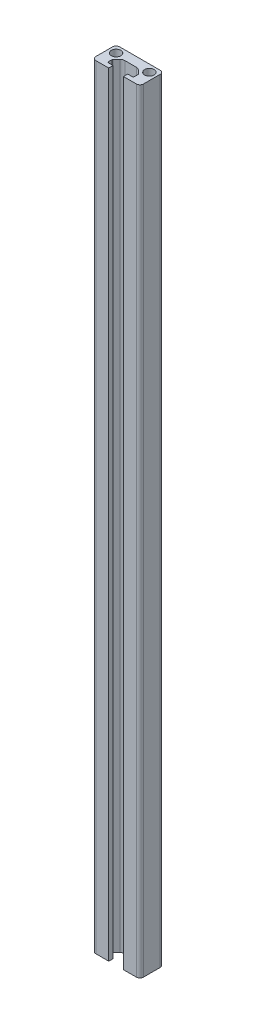
ISO-10303-21;
HEADER;
FILE_DESCRIPTION(('STEP AP214'),'2;1');
FILE_NAME('part.step','',(''),(''),'','','');
FILE_SCHEMA(('AUTOMOTIVE_DESIGN { 1 0 10303 214 1 1 1 1 }'));
ENDSEC;
DATA;
#1=APPLICATION_CONTEXT('core data for automotive mechanical design processes');
#2=APPLICATION_PROTOCOL_DEFINITION('international standard','automotive_design',2000,#1);
#3=PRODUCT_CONTEXT('',#1,'mechanical');
#4=PRODUCT('Part','Part','',(#3));
#5=PRODUCT_RELATED_PRODUCT_CATEGORY('part','',(#4));
#6=PRODUCT_DEFINITION_FORMATION('','',#4);
#7=PRODUCT_DEFINITION_CONTEXT('part definition',#1,'design');
#8=PRODUCT_DEFINITION('design','',#6,#7);
#9=PRODUCT_DEFINITION_SHAPE('','',#8);
#10=(LENGTH_UNIT() NAMED_UNIT(*) SI_UNIT(.MILLI.,.METRE.));
#11=(NAMED_UNIT(*) PLANE_ANGLE_UNIT() SI_UNIT($,.RADIAN.));
#12=(NAMED_UNIT(*) SI_UNIT($,.STERADIAN.) SOLID_ANGLE_UNIT());
#13=UNCERTAINTY_MEASURE_WITH_UNIT(LENGTH_MEASURE(1.E-05),#10,'distance_accuracy_value','');
#14=(GEOMETRIC_REPRESENTATION_CONTEXT(3) GLOBAL_UNCERTAINTY_ASSIGNED_CONTEXT((#13)) GLOBAL_UNIT_ASSIGNED_CONTEXT((#10,
#11,#12)) REPRESENTATION_CONTEXT('',''));
#15=CARTESIAN_POINT('',(0.,0.,0.));
#16=DIRECTION('',(0.,0.,1.));
#17=DIRECTION('',(1.,0.,0.));
#18=AXIS2_PLACEMENT_3D('',#15,#16,#17);
#19=CARTESIAN_POINT('',(-8.5,195.,0.));
#20=DIRECTION('',(0.,0.,-1.));
#21=DIRECTION('',(-1.,0.,0.));
#22=AXIS2_PLACEMENT_3D('',#19,#20,#21);
#23=PLANE('',#22);
#24=DIRECTION('',(0.,1.,0.));
#25=VECTOR('',#24,1.);
#26=CARTESIAN_POINT('',(-3.1,-195.,0.));
#27=LINE('',#26,#25);
#28=CARTESIAN_POINT('',(-3.1,-195.,0.));
#29=VERTEX_POINT('',#28);
#30=CARTESIAN_POINT('',(-3.1,130.,0.));
#31=VERTEX_POINT('',#30);
#32=EDGE_CURVE('E435',#29,#31,#27,.T.);
#33=ORIENTED_EDGE('',*,*,#32,.T.);
#34=DIRECTION('',(-1.,0.,0.));
#35=VECTOR('',#34,1.);
#36=CARTESIAN_POINT('',(-8.5,130.,0.));
#37=LINE('',#36,#35);
#38=CARTESIAN_POINT('',(-8.5,130.,0.));
#39=VERTEX_POINT('',#38);
#40=EDGE_CURVE('E333',#31,#39,#37,.T.);
#41=ORIENTED_EDGE('',*,*,#40,.T.);
#42=DIRECTION('',(0.,-1.,0.));
#43=VECTOR('',#42,1.);
#44=CARTESIAN_POINT('',(-8.5,195.,0.));
#45=LINE('',#44,#43);
#46=CARTESIAN_POINT('',(-8.5,-195.,0.));
#47=VERTEX_POINT('',#46);
#48=EDGE_CURVE('E235',#39,#47,#45,.T.);
#49=ORIENTED_EDGE('',*,*,#48,.T.);
#50=DIRECTION('',(1.,0.,0.));
#51=VECTOR('',#50,1.);
#52=CARTESIAN_POINT('',(-8.5,-195.,0.));
#53=LINE('',#52,#51);
#54=EDGE_CURVE('E464',#47,#29,#53,.T.);
#55=ORIENTED_EDGE('',*,*,#54,.T.);
#56=EDGE_LOOP('',(#33,#41,#49,#55));
#57=FACE_BOUND('',#56,.T.);
#58=ADVANCED_FACE('F44',(#57),#23,.F.);
#59=CARTESIAN_POINT('',(-8.5,-195.,-8.5));
#60=DIRECTION('',(0.,1.,0.));
#61=DIRECTION('',(0.,0.,1.));
#62=AXIS2_PLACEMENT_3D('',#59,#60,#61);
#63=PLANE('',#62);
#64=DIRECTION('',(-0.707106781186548,0.,0.707106781186548));
#65=VECTOR('',#64,1.);
#66=CARTESIAN_POINT('',(-5.45,-195.,-3.9));
#67=LINE('',#66,#65);
#68=CARTESIAN_POINT('',(-3.83578643762691,-195.,-5.5142135623731));
#69=VERTEX_POINT('',#68);
#70=CARTESIAN_POINT('',(-5.30355339059327,-195.,-4.04644660940673));
#71=VERTEX_POINT('',#70);
#72=EDGE_CURVE('E316',#69,#71,#67,.T.);
#73=ORIENTED_EDGE('',*,*,#72,.T.);
#74=CARTESIAN_POINT('',(-4.95,-195.,-3.69289321881346));
#75=DIRECTION('',(0.,1.,0.));
#76=DIRECTION('',(0.,0.,1.));
#77=AXIS2_PLACEMENT_3D('',#74,#75,#76);
#78=CIRCLE('',#77,0.5);
#79=CARTESIAN_POINT('',(-5.45,-195.,-3.69289321881346));
#80=VERTEX_POINT('',#79);
#81=EDGE_CURVE('E306',#71,#80,#78,.T.);
#82=ORIENTED_EDGE('',*,*,#81,.T.);
#83=DIRECTION('',(0.,0.,1.));
#84=VECTOR('',#83,1.);
#85=CARTESIAN_POINT('',(-5.45,-195.,-3.9));
#86=LINE('',#85,#84);
#87=CARTESIAN_POINT('',(-5.45,-195.,-2.3));
#88=VERTEX_POINT('',#87);
#89=EDGE_CURVE('E314',#80,#88,#86,.T.);
#90=ORIENTED_EDGE('',*,*,#89,.T.);
#91=CARTESIAN_POINT('',(-4.95,-195.,-2.3));
#92=DIRECTION('',(0.,1.,0.));
#93=DIRECTION('',(0.,0.,1.));
#94=AXIS2_PLACEMENT_3D('',#91,#92,#93);
#95=CIRCLE('',#94,0.5);
#96=CARTESIAN_POINT('',(-4.95,-195.,-1.8));
#97=VERTEX_POINT('',#96);
#98=EDGE_CURVE('E53',#88,#97,#95,.T.);
#99=ORIENTED_EDGE('',*,*,#98,.T.);
#100=DIRECTION('',(1.,0.,0.));
#101=VECTOR('',#100,1.);
#102=CARTESIAN_POINT('',(-5.45,-195.,-1.8));
#103=LINE('',#102,#101);
#104=CARTESIAN_POINT('',(-3.1,-195.,-1.8));
#105=VERTEX_POINT('',#104);
#106=EDGE_CURVE('E417',#97,#105,#103,.T.);
#107=ORIENTED_EDGE('',*,*,#106,.T.);
#108=DIRECTION('',(0.,0.,1.));
#109=VECTOR('',#108,1.);
#110=CARTESIAN_POINT('',(-3.1,-195.,-6.1));
#111=LINE('',#110,#109);
#112=EDGE_CURVE('E424',#105,#29,#111,.T.);
#113=ORIENTED_EDGE('',*,*,#112,.T.);
#114=ORIENTED_EDGE('',*,*,#54,.F.);
#115=CARTESIAN_POINT('',(-8.5,-195.,-1.5));
#116=DIRECTION('',(0.,1.,0.));
#117=DIRECTION('',(0.,0.,1.));
#118=AXIS2_PLACEMENT_3D('',#115,#116,#117);
#119=CIRCLE('',#118,1.5);
#120=CARTESIAN_POINT('',(-10.,-195.,-1.5));
#121=VERTEX_POINT('',#120);
#122=EDGE_CURVE('E459',#121,#47,#119,.T.);
#123=ORIENTED_EDGE('',*,*,#122,.F.);
#124=DIRECTION('',(0.,0.,1.));
#125=VECTOR('',#124,1.);
#126=CARTESIAN_POINT('',(-10.,-195.,-8.5));
#127=LINE('',#126,#125);
#128=CARTESIAN_POINT('',(-10.,-195.,-8.5));
#129=VERTEX_POINT('',#128);
#130=EDGE_CURVE('E455',#129,#121,#127,.T.);
#131=ORIENTED_EDGE('',*,*,#130,.F.);
#132=CARTESIAN_POINT('',(-8.5,-195.,-8.5));
#133=DIRECTION('',(0.,1.,0.));
#134=DIRECTION('',(0.,0.,1.));
#135=AXIS2_PLACEMENT_3D('',#132,#133,#134);
#136=CIRCLE('',#135,1.5);
#137=CARTESIAN_POINT('',(-8.5,-195.,-10.));
#138=VERTEX_POINT('',#137);
#139=EDGE_CURVE('E451',#138,#129,#136,.T.);
#140=ORIENTED_EDGE('',*,*,#139,.F.);
#141=DIRECTION('',(-1.,0.,0.));
#142=VECTOR('',#141,1.);
#143=CARTESIAN_POINT('',(-8.5,-195.,-10.));
#144=LINE('',#143,#142);
#145=CARTESIAN_POINT('',(8.5,-195.,-10.));
#146=VERTEX_POINT('',#145);
#147=EDGE_CURVE('E477',#146,#138,#144,.T.);
#148=ORIENTED_EDGE('',*,*,#147,.F.);
#149=CARTESIAN_POINT('',(8.5,-195.,-8.5));
#150=DIRECTION('',(0.,1.,0.));
#151=DIRECTION('',(0.,0.,-1.));
#152=AXIS2_PLACEMENT_3D('',#149,#150,#151);
#153=CIRCLE('',#152,1.5);
#154=CARTESIAN_POINT('',(10.,-195.,-8.5));
#155=VERTEX_POINT('',#154);
#156=EDGE_CURVE('E473',#155,#146,#153,.T.);
#157=ORIENTED_EDGE('',*,*,#156,.F.);
#158=DIRECTION('',(0.,0.,-1.));
#159=VECTOR('',#158,1.);
#160=CARTESIAN_POINT('',(10.,-195.,-8.5));
#161=LINE('',#160,#159);
#162=CARTESIAN_POINT('',(10.,-195.,-1.5));
#163=VERTEX_POINT('',#162);
#164=EDGE_CURVE('E470',#163,#155,#161,.T.);
#165=ORIENTED_EDGE('',*,*,#164,.F.);
#166=CARTESIAN_POINT('',(8.5,-195.,-1.5));
#167=DIRECTION('',(0.,1.,0.));
#168=DIRECTION('',(0.,0.,1.));
#169=AXIS2_PLACEMENT_3D('',#166,#167,#168);
#170=CIRCLE('',#169,1.5);
#171=CARTESIAN_POINT('',(8.5,-195.,0.));
#172=VERTEX_POINT('',#171);
#173=EDGE_CURVE('E228',#172,#163,#170,.T.);
#174=ORIENTED_EDGE('',*,*,#173,.F.);
#175=CARTESIAN_POINT('',(3.1,-195.,0.));
#176=VERTEX_POINT('',#175);
#177=EDGE_CURVE('E463',#176,#172,#53,.T.);
#178=ORIENTED_EDGE('',*,*,#177,.F.);
#179=DIRECTION('',(0.,0.,-1.));
#180=VECTOR('',#179,1.);
#181=CARTESIAN_POINT('',(3.1,-195.,-6.1));
#182=LINE('',#181,#180);
#183=CARTESIAN_POINT('',(3.1,-195.,-1.8));
#184=VERTEX_POINT('',#183);
#185=EDGE_CURVE('E427',#176,#184,#182,.T.);
#186=ORIENTED_EDGE('',*,*,#185,.T.);
#187=CARTESIAN_POINT('',(4.95,-195.,-1.8));
#188=VERTEX_POINT('',#187);
#189=EDGE_CURVE('E325',#184,#188,#103,.T.);
#190=ORIENTED_EDGE('',*,*,#189,.T.);
#191=CARTESIAN_POINT('',(4.95,-195.,-2.3));
#192=DIRECTION('',(0.,1.,0.));
#193=DIRECTION('',(0.,0.,1.));
#194=AXIS2_PLACEMENT_3D('',#191,#192,#193);
#195=CIRCLE('',#194,0.5);
#196=CARTESIAN_POINT('',(5.45,-195.,-2.3));
#197=VERTEX_POINT('',#196);
#198=EDGE_CURVE('E303',#188,#197,#195,.T.);
#199=ORIENTED_EDGE('',*,*,#198,.T.);
#200=DIRECTION('',(0.,0.,-1.));
#201=VECTOR('',#200,1.);
#202=CARTESIAN_POINT('',(5.45,-195.,-3.9));
#203=LINE('',#202,#201);
#204=CARTESIAN_POINT('',(5.45,-195.,-3.69289321881346));
#205=VERTEX_POINT('',#204);
#206=EDGE_CURVE('E407',#197,#205,#203,.T.);
#207=ORIENTED_EDGE('',*,*,#206,.T.);
#208=CARTESIAN_POINT('',(4.95,-195.,-3.69289321881346));
#209=DIRECTION('',(0.,1.,0.));
#210=DIRECTION('',(0.,0.,1.));
#211=AXIS2_PLACEMENT_3D('',#208,#209,#210);
#212=CIRCLE('',#211,0.5);
#213=CARTESIAN_POINT('',(5.30355339059327,-195.,-4.04644660940673));
#214=VERTEX_POINT('',#213);
#215=EDGE_CURVE('E300',#205,#214,#212,.T.);
#216=ORIENTED_EDGE('',*,*,#215,.T.);
#217=DIRECTION('',(-0.707106781186548,0.,-0.707106781186548));
#218=VECTOR('',#217,1.);
#219=CARTESIAN_POINT('',(3.25,-195.,-6.1));
#220=LINE('',#219,#218);
#221=CARTESIAN_POINT('',(3.83578643762691,-195.,-5.5142135623731));
#222=VERTEX_POINT('',#221);
#223=EDGE_CURVE('E411',#214,#222,#220,.T.);
#224=ORIENTED_EDGE('',*,*,#223,.T.);
#225=CARTESIAN_POINT('',(2.42157287525381,-195.,-4.1));
#226=DIRECTION('',(0.,1.,0.));
#227=DIRECTION('',(0.,0.,1.));
#228=AXIS2_PLACEMENT_3D('',#225,#226,#227);
#229=CIRCLE('',#228,2.);
#230=CARTESIAN_POINT('',(2.42157287525381,-195.,-6.1));
#231=VERTEX_POINT('',#230);
#232=EDGE_CURVE('E266',#222,#231,#229,.T.);
#233=ORIENTED_EDGE('',*,*,#232,.T.);
#234=DIRECTION('',(-1.,0.,0.));
#235=VECTOR('',#234,1.);
#236=CARTESIAN_POINT('',(-3.1,-195.,-6.1));
#237=LINE('',#236,#235);
#238=CARTESIAN_POINT('',(-2.42157287525381,-195.,-6.1));
#239=VERTEX_POINT('',#238);
#240=EDGE_CURVE('E431',#231,#239,#237,.T.);
#241=ORIENTED_EDGE('',*,*,#240,.T.);
#242=CARTESIAN_POINT('',(-2.42157287525381,-195.,-4.1));
#243=DIRECTION('',(0.,1.,0.));
#244=DIRECTION('',(0.,0.,1.));
#245=AXIS2_PLACEMENT_3D('',#242,#243,#244);
#246=CIRCLE('',#245,2.);
#247=EDGE_CURVE('E269',#239,#69,#246,.T.);
#248=ORIENTED_EDGE('',*,*,#247,.T.);
#249=EDGE_LOOP('',(#73,#82,#90,#99,#107,#113,#114,#123,#131,#140,#148,#157,#165,#174,#178,#186,
#190,#199,#207,#216,#224,#233,#241,#248));
#250=FACE_BOUND('',#249,.T.);
#251=CARTESIAN_POINT('',(-7.,-195.,-7.));
#252=DIRECTION('',(0.,1.,0.));
#253=DIRECTION('',(0.,0.,1.));
#254=AXIS2_PLACEMENT_3D('',#251,#252,#253);
#255=CIRCLE('',#254,2.);
#256=CARTESIAN_POINT('',(-7.,-195.,-5.));
#257=VERTEX_POINT('',#256);
#258=EDGE_CURVE('E447',#257,#257,#255,.T.);
#259=ORIENTED_EDGE('',*,*,#258,.T.);
#260=EDGE_LOOP('',(#259));
#261=FACE_BOUND('',#260,.T.);
#262=CARTESIAN_POINT('',(7.,-195.,-7.));
#263=DIRECTION('',(0.,1.,0.));
#264=DIRECTION('',(0.,0.,1.));
#265=AXIS2_PLACEMENT_3D('',#262,#263,#264);
#266=CIRCLE('',#265,2.);
#267=CARTESIAN_POINT('',(7.,-195.,-5.));
#268=VERTEX_POINT('',#267);
#269=EDGE_CURVE('E440',#268,#268,#266,.T.);
#270=ORIENTED_EDGE('',*,*,#269,.T.);
#271=EDGE_LOOP('',(#270));
#272=FACE_BOUND('',#271,.T.);
#273=ADVANCED_FACE('F312',(#250,#261,#272),#63,.F.);
#274=CARTESIAN_POINT('',(-8.5,195.,-8.5));
#275=DIRECTION('',(0.,-1.,0.));
#276=DIRECTION('',(0.,0.,-1.));
#277=AXIS2_PLACEMENT_3D('',#274,#275,#276);
#278=CYLINDRICAL_SURFACE('',#277,1.5);
#279=DIRECTION('',(0.,-1.,0.));
#280=VECTOR('',#279,1.);
#281=CARTESIAN_POINT('',(-10.,195.,-8.5));
#282=LINE('',#281,#280);
#283=CARTESIAN_POINT('',(-10.,130.,-8.5));
#284=VERTEX_POINT('',#283);
#285=EDGE_CURVE('E246',#284,#129,#282,.T.);
#286=ORIENTED_EDGE('',*,*,#285,.F.);
#287=CARTESIAN_POINT('',(-8.5,130.,-8.5));
#288=DIRECTION('',(0.,-1.,0.));
#289=DIRECTION('',(0.,0.,-1.));
#290=AXIS2_PLACEMENT_3D('',#287,#288,#289);
#291=CIRCLE('',#290,1.5);
#292=CARTESIAN_POINT('',(-8.5,130.,-10.));
#293=VERTEX_POINT('',#292);
#294=EDGE_CURVE('E351',#284,#293,#291,.T.);
#295=ORIENTED_EDGE('',*,*,#294,.T.);
#296=DIRECTION('',(0.,-1.,0.));
#297=VECTOR('',#296,1.);
#298=CARTESIAN_POINT('',(-8.5,195.,-10.));
#299=LINE('',#298,#297);
#300=EDGE_CURVE('E481',#293,#138,#299,.T.);
#301=ORIENTED_EDGE('',*,*,#300,.T.);
#302=ORIENTED_EDGE('',*,*,#139,.T.);
#303=EDGE_LOOP('',(#286,#295,#301,#302));
#304=FACE_BOUND('',#303,.T.);
#305=ADVANCED_FACE('F497',(#304),#278,.T.);
#306=CARTESIAN_POINT('',(-10.,195.,-8.5));
#307=DIRECTION('',(1.,0.,0.));
#308=DIRECTION('',(0.,0.,-1.));
#309=AXIS2_PLACEMENT_3D('',#306,#307,#308);
#310=PLANE('',#309);
#311=DIRECTION('',(0.,-1.,0.));
#312=VECTOR('',#311,1.);
#313=CARTESIAN_POINT('',(-10.,195.,-1.5));
#314=LINE('',#313,#312);
#315=CARTESIAN_POINT('',(-10.,130.,-1.5));
#316=VERTEX_POINT('',#315);
#317=EDGE_CURVE('E243',#316,#121,#314,.T.);
#318=ORIENTED_EDGE('',*,*,#317,.F.);
#319=DIRECTION('',(0.,0.,-1.));
#320=VECTOR('',#319,1.);
#321=CARTESIAN_POINT('',(-10.,130.,-8.5));
#322=LINE('',#321,#320);
#323=EDGE_CURVE('E347',#316,#284,#322,.T.);
#324=ORIENTED_EDGE('',*,*,#323,.T.);
#325=ORIENTED_EDGE('',*,*,#285,.T.);
#326=ORIENTED_EDGE('',*,*,#130,.T.);
#327=EDGE_LOOP('',(#318,#324,#325,#326));
#328=FACE_BOUND('',#327,.T.);
#329=ADVANCED_FACE('F500',(#328),#310,.F.);
#330=CARTESIAN_POINT('',(-8.5,195.,-1.5));
#331=DIRECTION('',(0.,-1.,0.));
#332=DIRECTION('',(0.,0.,-1.));
#333=AXIS2_PLACEMENT_3D('',#330,#331,#332);
#334=CYLINDRICAL_SURFACE('',#333,1.5);
#335=ORIENTED_EDGE('',*,*,#48,.F.);
#336=CARTESIAN_POINT('',(-8.5,130.,-1.5));
#337=DIRECTION('',(0.,-1.,0.));
#338=DIRECTION('',(0.,0.,-1.));
#339=AXIS2_PLACEMENT_3D('',#336,#337,#338);
#340=CIRCLE('',#339,1.5);
#341=EDGE_CURVE('E337',#39,#316,#340,.T.);
#342=ORIENTED_EDGE('',*,*,#341,.T.);
#343=ORIENTED_EDGE('',*,*,#317,.T.);
#344=ORIENTED_EDGE('',*,*,#122,.T.);
#345=EDGE_LOOP('',(#335,#342,#343,#344));
#346=FACE_BOUND('',#345,.T.);
#347=ADVANCED_FACE('F503',(#346),#334,.T.);
#348=DIRECTION('',(0.,-1.,0.));
#349=VECTOR('',#348,1.);
#350=CARTESIAN_POINT('',(8.5,195.,0.));
#351=LINE('',#350,#349);
#352=CARTESIAN_POINT('',(8.5,130.,0.));
#353=VERTEX_POINT('',#352);
#354=EDGE_CURVE('E231',#353,#172,#351,.T.);
#355=ORIENTED_EDGE('',*,*,#354,.F.);
#356=DIRECTION('',(-1.,0.,0.));
#357=VECTOR('',#356,1.);
#358=CARTESIAN_POINT('',(-8.5,130.,0.));
#359=LINE('',#358,#357);
#360=CARTESIAN_POINT('',(3.1,130.,0.));
#361=VERTEX_POINT('',#360);
#362=EDGE_CURVE('E209',#353,#361,#359,.T.);
#363=ORIENTED_EDGE('',*,*,#362,.T.);
#364=DIRECTION('',(0.,1.,0.));
#365=VECTOR('',#364,1.);
#366=CARTESIAN_POINT('',(3.1,-195.,0.));
#367=LINE('',#366,#365);
#368=EDGE_CURVE('E436',#176,#361,#367,.T.);
#369=ORIENTED_EDGE('',*,*,#368,.F.);
#370=ORIENTED_EDGE('',*,*,#177,.T.);
#371=EDGE_LOOP('',(#355,#363,#369,#370));
#372=FACE_BOUND('',#371,.T.);
#373=ADVANCED_FACE('F540',(#372),#23,.F.);
#374=CARTESIAN_POINT('',(8.5,195.,-1.5));
#375=DIRECTION('',(0.,-1.,0.));
#376=DIRECTION('',(0.,0.,-1.));
#377=AXIS2_PLACEMENT_3D('',#374,#375,#376);
#378=CYLINDRICAL_SURFACE('',#377,1.5);
#379=DIRECTION('',(0.,-1.,0.));
#380=VECTOR('',#379,1.);
#381=CARTESIAN_POINT('',(10.,195.,-1.5));
#382=LINE('',#381,#380);
#383=CARTESIAN_POINT('',(10.,130.,-1.5));
#384=VERTEX_POINT('',#383);
#385=EDGE_CURVE('E220',#384,#163,#382,.T.);
#386=ORIENTED_EDGE('',*,*,#385,.F.);
#387=CARTESIAN_POINT('',(8.5,130.,-1.5));
#388=DIRECTION('',(0.,-1.,0.));
#389=DIRECTION('',(0.,0.,-1.));
#390=AXIS2_PLACEMENT_3D('',#387,#388,#389);
#391=CIRCLE('',#390,1.5);
#392=EDGE_CURVE('E203',#384,#353,#391,.T.);
#393=ORIENTED_EDGE('',*,*,#392,.T.);
#394=ORIENTED_EDGE('',*,*,#354,.T.);
#395=ORIENTED_EDGE('',*,*,#173,.T.);
#396=EDGE_LOOP('',(#386,#393,#394,#395));
#397=FACE_BOUND('',#396,.T.);
#398=ADVANCED_FACE('F226',(#397),#378,.T.);
#399=CARTESIAN_POINT('',(10.,195.,-8.5));
#400=DIRECTION('',(-1.,0.,0.));
#401=DIRECTION('',(0.,0.,1.));
#402=AXIS2_PLACEMENT_3D('',#399,#400,#401);
#403=PLANE('',#402);
#404=DIRECTION('',(0.,-1.,0.));
#405=VECTOR('',#404,1.);
#406=CARTESIAN_POINT('',(10.,195.,-8.5));
#407=LINE('',#406,#405);
#408=CARTESIAN_POINT('',(10.,130.,-8.5));
#409=VERTEX_POINT('',#408);
#410=EDGE_CURVE('E222',#409,#155,#407,.T.);
#411=ORIENTED_EDGE('',*,*,#410,.F.);
#412=DIRECTION('',(0.,0.,-1.));
#413=VECTOR('',#412,1.);
#414=CARTESIAN_POINT('',(10.,130.,2.55461506248636));
#415=LINE('',#414,#413);
#416=EDGE_CURVE('E206',#384,#409,#415,.T.);
#417=ORIENTED_EDGE('',*,*,#416,.F.);
#418=ORIENTED_EDGE('',*,*,#385,.T.);
#419=ORIENTED_EDGE('',*,*,#164,.T.);
#420=EDGE_LOOP('',(#411,#417,#418,#419));
#421=FACE_BOUND('',#420,.T.);
#422=ADVANCED_FACE('F218',(#421),#403,.F.);
#423=CARTESIAN_POINT('',(8.5,195.,-8.5));
#424=DIRECTION('',(0.,-1.,0.));
#425=DIRECTION('',(0.,0.,-1.));
#426=AXIS2_PLACEMENT_3D('',#423,#424,#425);
#427=CYLINDRICAL_SURFACE('',#426,1.5);
#428=DIRECTION('',(0.,-1.,0.));
#429=VECTOR('',#428,1.);
#430=CARTESIAN_POINT('',(8.5,195.,-10.));
#431=LINE('',#430,#429);
#432=CARTESIAN_POINT('',(8.5,130.,-10.));
#433=VERTEX_POINT('',#432);
#434=EDGE_CURVE('E237',#433,#146,#431,.T.);
#435=ORIENTED_EDGE('',*,*,#434,.F.);
#436=CARTESIAN_POINT('',(8.5,130.,-8.5));
#437=DIRECTION('',(0.,-1.,0.));
#438=DIRECTION('',(0.,0.,-1.));
#439=AXIS2_PLACEMENT_3D('',#436,#437,#438);
#440=CIRCLE('',#439,1.5);
#441=EDGE_CURVE('E367',#433,#409,#440,.T.);
#442=ORIENTED_EDGE('',*,*,#441,.T.);
#443=ORIENTED_EDGE('',*,*,#410,.T.);
#444=ORIENTED_EDGE('',*,*,#156,.T.);
#445=EDGE_LOOP('',(#435,#442,#443,#444));
#446=FACE_BOUND('',#445,.T.);
#447=ADVANCED_FACE('F492',(#446),#427,.T.);
#448=CARTESIAN_POINT('',(-8.5,195.,-10.));
#449=DIRECTION('',(0.,0.,1.));
#450=DIRECTION('',(1.,0.,0.));
#451=AXIS2_PLACEMENT_3D('',#448,#449,#450);
#452=PLANE('',#451);
#453=ORIENTED_EDGE('',*,*,#300,.F.);
#454=DIRECTION('',(1.,0.,0.));
#455=VECTOR('',#454,1.);
#456=CARTESIAN_POINT('',(-8.5,130.,-10.));
#457=LINE('',#456,#455);
#458=EDGE_CURVE('E363',#293,#433,#457,.T.);
#459=ORIENTED_EDGE('',*,*,#458,.T.);
#460=ORIENTED_EDGE('',*,*,#434,.T.);
#461=ORIENTED_EDGE('',*,*,#147,.T.);
#462=EDGE_LOOP('',(#453,#459,#460,#461));
#463=FACE_BOUND('',#462,.T.);
#464=ADVANCED_FACE('F487',(#463),#452,.F.);
#465=CARTESIAN_POINT('',(-7.,195.,-7.));
#466=DIRECTION('',(0.,-1.,0.));
#467=DIRECTION('',(0.,0.,-1.));
#468=AXIS2_PLACEMENT_3D('',#465,#466,#467);
#469=CYLINDRICAL_SURFACE('',#468,2.);
#470=CARTESIAN_POINT('',(-7.,130.,-7.));
#471=DIRECTION('',(0.,-1.,0.));
#472=DIRECTION('',(0.,0.,-1.));
#473=AXIS2_PLACEMENT_3D('',#470,#471,#472);
#474=CIRCLE('',#473,2.);
#475=CARTESIAN_POINT('',(-7.,130.,-9.));
#476=VERTEX_POINT('',#475);
#477=EDGE_CURVE('E403',#476,#476,#474,.T.);
#478=ORIENTED_EDGE('',*,*,#477,.F.);
#479=EDGE_LOOP('',(#478));
#480=FACE_BOUND('',#479,.T.);
#481=ORIENTED_EDGE('',*,*,#258,.F.);
#482=EDGE_LOOP('',(#481));
#483=FACE_BOUND('',#482,.T.);
#484=ADVANCED_FACE('F602',(#480,#483),#469,.F.);
#485=CARTESIAN_POINT('',(7.,195.,-7.));
#486=DIRECTION('',(0.,-1.,0.));
#487=DIRECTION('',(0.,0.,-1.));
#488=AXIS2_PLACEMENT_3D('',#485,#486,#487);
#489=CYLINDRICAL_SURFACE('',#488,2.);
#490=CARTESIAN_POINT('',(7.,130.,-7.));
#491=DIRECTION('',(0.,-1.,0.));
#492=DIRECTION('',(0.,0.,-1.));
#493=AXIS2_PLACEMENT_3D('',#490,#491,#492);
#494=CIRCLE('',#493,2.);
#495=CARTESIAN_POINT('',(7.,130.,-9.));
#496=VERTEX_POINT('',#495);
#497=EDGE_CURVE('E214',#496,#496,#494,.T.);
#498=ORIENTED_EDGE('',*,*,#497,.F.);
#499=EDGE_LOOP('',(#498));
#500=FACE_BOUND('',#499,.T.);
#501=ORIENTED_EDGE('',*,*,#269,.F.);
#502=EDGE_LOOP('',(#501));
#503=FACE_BOUND('',#502,.T.);
#504=ADVANCED_FACE('F599',(#500,#503),#489,.F.);
#505=CARTESIAN_POINT('',(-3.1,-195.,-6.1));
#506=DIRECTION('',(-1.,0.,0.));
#507=DIRECTION('',(0.,0.,1.));
#508=AXIS2_PLACEMENT_3D('',#505,#506,#507);
#509=PLANE('',#508);
#510=DIRECTION('',(0.,1.,0.));
#511=VECTOR('',#510,1.);
#512=CARTESIAN_POINT('',(-3.1,-195.,-1.8));
#513=LINE('',#512,#511);
#514=CARTESIAN_POINT('',(-3.1,130.,-1.8));
#515=VERTEX_POINT('',#514);
#516=EDGE_CURVE('E420',#105,#515,#513,.T.);
#517=ORIENTED_EDGE('',*,*,#516,.T.);
#518=DIRECTION('',(0.,0.,1.));
#519=VECTOR('',#518,1.);
#520=CARTESIAN_POINT('',(-3.1,130.,-6.1));
#521=LINE('',#520,#519);
#522=EDGE_CURVE('E340',#515,#31,#521,.T.);
#523=ORIENTED_EDGE('',*,*,#522,.T.);
#524=ORIENTED_EDGE('',*,*,#32,.F.);
#525=ORIENTED_EDGE('',*,*,#112,.F.);
#526=EDGE_LOOP('',(#517,#523,#524,#525));
#527=FACE_BOUND('',#526,.T.);
#528=ADVANCED_FACE('F510',(#527),#509,.F.);
#529=CARTESIAN_POINT('',(-3.1,-195.,-6.1));
#530=DIRECTION('',(0.,0.,-1.));
#531=DIRECTION('',(-1.,0.,0.));
#532=AXIS2_PLACEMENT_3D('',#529,#530,#531);
#533=PLANE('',#532);
#534=DIRECTION('',(0.,1.,0.));
#535=VECTOR('',#534,1.);
#536=CARTESIAN_POINT('',(2.42157287525381,195.,-6.1));
#537=LINE('',#536,#535);
#538=CARTESIAN_POINT('',(2.42157287525381,130.,-6.1));
#539=VERTEX_POINT('',#538);
#540=EDGE_CURVE('E255',#231,#539,#537,.T.);
#541=ORIENTED_EDGE('',*,*,#540,.T.);
#542=DIRECTION('',(-1.,0.,0.));
#543=VECTOR('',#542,1.);
#544=CARTESIAN_POINT('',(-3.1,130.,-6.1));
#545=LINE('',#544,#543);
#546=CARTESIAN_POINT('',(-2.42157287525381,130.,-6.1));
#547=VERTEX_POINT('',#546);
#548=EDGE_CURVE('E359',#539,#547,#545,.T.);
#549=ORIENTED_EDGE('',*,*,#548,.T.);
#550=DIRECTION('',(0.,1.,0.));
#551=VECTOR('',#550,1.);
#552=CARTESIAN_POINT('',(-2.42157287525381,-195.,-6.1));
#553=LINE('',#552,#551);
#554=EDGE_CURVE('E252',#547,#239,#553,.F.);
#555=ORIENTED_EDGE('',*,*,#554,.T.);
#556=ORIENTED_EDGE('',*,*,#240,.F.);
#557=EDGE_LOOP('',(#541,#549,#555,#556));
#558=FACE_BOUND('',#557,.T.);
#559=ADVANCED_FACE('F582',(#558),#533,.F.);
#560=CARTESIAN_POINT('',(3.1,-195.,-6.1));
#561=DIRECTION('',(1.,0.,0.));
#562=DIRECTION('',(0.,0.,-1.));
#563=AXIS2_PLACEMENT_3D('',#560,#561,#562);
#564=PLANE('',#563);
#565=ORIENTED_EDGE('',*,*,#368,.T.);
#566=DIRECTION('',(0.,0.,-1.));
#567=VECTOR('',#566,1.);
#568=CARTESIAN_POINT('',(3.1,130.,-6.1));
#569=LINE('',#568,#567);
#570=CARTESIAN_POINT('',(3.1,130.,-1.8));
#571=VERTEX_POINT('',#570);
#572=EDGE_CURVE('E394',#361,#571,#569,.T.);
#573=ORIENTED_EDGE('',*,*,#572,.T.);
#574=DIRECTION('',(0.,-1.,0.));
#575=VECTOR('',#574,1.);
#576=CARTESIAN_POINT('',(3.1,-195.,-1.8));
#577=LINE('',#576,#575);
#578=EDGE_CURVE('E249',#571,#184,#577,.T.);
#579=ORIENTED_EDGE('',*,*,#578,.T.);
#580=ORIENTED_EDGE('',*,*,#185,.F.);
#581=EDGE_LOOP('',(#565,#573,#579,#580));
#582=FACE_BOUND('',#581,.T.);
#583=ADVANCED_FACE('F536',(#582),#564,.F.);
#584=CARTESIAN_POINT('',(-5.45,-195.,-1.8));
#585=DIRECTION('',(0.,0.,1.));
#586=DIRECTION('',(1.,0.,0.));
#587=AXIS2_PLACEMENT_3D('',#584,#585,#586);
#588=PLANE('',#587);
#589=ORIENTED_EDGE('',*,*,#578,.F.);
#590=DIRECTION('',(1.,0.,0.));
#591=VECTOR('',#590,1.);
#592=CARTESIAN_POINT('',(-5.45,130.,-1.8));
#593=LINE('',#592,#591);
#594=CARTESIAN_POINT('',(4.95,130.,-1.8));
#595=VERTEX_POINT('',#594);
#596=EDGE_CURVE('E390',#571,#595,#593,.T.);
#597=ORIENTED_EDGE('',*,*,#596,.T.);
#598=DIRECTION('',(0.,1.,0.));
#599=VECTOR('',#598,1.);
#600=CARTESIAN_POINT('',(4.95,-195.,-1.8));
#601=LINE('',#600,#599);
#602=EDGE_CURVE('E283',#595,#188,#601,.F.);
#603=ORIENTED_EDGE('',*,*,#602,.T.);
#604=ORIENTED_EDGE('',*,*,#189,.F.);
#605=EDGE_LOOP('',(#589,#597,#603,#604));
#606=FACE_BOUND('',#605,.T.);
#607=ADVANCED_FACE('F524',(#606),#588,.F.);
#608=CARTESIAN_POINT('',(3.25,-195.,-6.1));
#609=DIRECTION('',(0.707106781186548,0.,-0.707106781186548));
#610=DIRECTION('',(-0.707106781186548,0.,-0.707106781186548));
#611=AXIS2_PLACEMENT_3D('',#608,#609,#610);
#612=PLANE('',#611);
#613=DIRECTION('',(0.,1.,0.));
#614=VECTOR('',#613,1.);
#615=CARTESIAN_POINT('',(5.30355339059327,195.,-4.04644660940673));
#616=LINE('',#615,#614);
#617=CARTESIAN_POINT('',(5.30355339059327,130.,-4.04644660940673));
#618=VERTEX_POINT('',#617);
#619=EDGE_CURVE('E272',#214,#618,#616,.T.);
#620=ORIENTED_EDGE('',*,*,#619,.T.);
#621=DIRECTION('',(-0.707106781186548,0.,-0.707106781186548));
#622=VECTOR('',#621,1.);
#623=CARTESIAN_POINT('',(3.25,130.,-6.1));
#624=LINE('',#623,#622);
#625=CARTESIAN_POINT('',(3.8357864376269,130.,-5.5142135623731));
#626=VERTEX_POINT('',#625);
#627=EDGE_CURVE('E374',#618,#626,#624,.T.);
#628=ORIENTED_EDGE('',*,*,#627,.T.);
#629=DIRECTION('',(0.,1.,0.));
#630=VECTOR('',#629,1.);
#631=CARTESIAN_POINT('',(3.83578643762691,-195.,-5.5142135623731));
#632=LINE('',#631,#630);
#633=EDGE_CURVE('E259',#626,#222,#632,.F.);
#634=ORIENTED_EDGE('',*,*,#633,.T.);
#635=ORIENTED_EDGE('',*,*,#223,.F.);
#636=EDGE_LOOP('',(#620,#628,#634,#635));
#637=FACE_BOUND('',#636,.T.);
#638=ADVANCED_FACE('F531',(#637),#612,.F.);
#639=CARTESIAN_POINT('',(5.45,-195.,-3.9));
#640=DIRECTION('',(1.,0.,0.));
#641=DIRECTION('',(0.,0.,-1.));
#642=AXIS2_PLACEMENT_3D('',#639,#640,#641);
#643=PLANE('',#642);
#644=DIRECTION('',(0.,1.,0.));
#645=VECTOR('',#644,1.);
#646=CARTESIAN_POINT('',(5.45,195.,-2.3));
#647=LINE('',#646,#645);
#648=CARTESIAN_POINT('',(5.45,130.,-2.3));
#649=VERTEX_POINT('',#648);
#650=EDGE_CURVE('E276',#197,#649,#647,.T.);
#651=ORIENTED_EDGE('',*,*,#650,.T.);
#652=DIRECTION('',(0.,0.,-1.));
#653=VECTOR('',#652,1.);
#654=CARTESIAN_POINT('',(5.45,130.,-3.9));
#655=LINE('',#654,#653);
#656=CARTESIAN_POINT('',(5.45,130.,-3.69289321881346));
#657=VERTEX_POINT('',#656);
#658=EDGE_CURVE('E382',#649,#657,#655,.T.);
#659=ORIENTED_EDGE('',*,*,#658,.T.);
#660=DIRECTION('',(0.,1.,0.));
#661=VECTOR('',#660,1.);
#662=CARTESIAN_POINT('',(5.45,-195.,-3.69289321881346));
#663=LINE('',#662,#661);
#664=EDGE_CURVE('E280',#657,#205,#663,.F.);
#665=ORIENTED_EDGE('',*,*,#664,.T.);
#666=ORIENTED_EDGE('',*,*,#206,.F.);
#667=EDGE_LOOP('',(#651,#659,#665,#666));
#668=FACE_BOUND('',#667,.T.);
#669=ADVANCED_FACE('F522',(#668),#643,.F.);
#670=DIRECTION('',(0.,1.,0.));
#671=VECTOR('',#670,1.);
#672=CARTESIAN_POINT('',(-4.95,195.,-1.8));
#673=LINE('',#672,#671);
#674=CARTESIAN_POINT('',(-4.95,130.,-1.8));
#675=VERTEX_POINT('',#674);
#676=EDGE_CURVE('E296',#97,#675,#673,.T.);
#677=ORIENTED_EDGE('',*,*,#676,.T.);
#678=DIRECTION('',(1.,0.,0.));
#679=VECTOR('',#678,1.);
#680=CARTESIAN_POINT('',(-5.45,130.,-1.8));
#681=LINE('',#680,#679);
#682=EDGE_CURVE('E60',#675,#515,#681,.T.);
#683=ORIENTED_EDGE('',*,*,#682,.T.);
#684=ORIENTED_EDGE('',*,*,#516,.F.);
#685=ORIENTED_EDGE('',*,*,#106,.F.);
#686=EDGE_LOOP('',(#677,#683,#684,#685));
#687=FACE_BOUND('',#686,.T.);
#688=ADVANCED_FACE('F520',(#687),#588,.F.);
#689=CARTESIAN_POINT('',(-5.45,-195.,-3.9));
#690=DIRECTION('',(-1.,0.,0.));
#691=DIRECTION('',(0.,0.,1.));
#692=AXIS2_PLACEMENT_3D('',#689,#690,#691);
#693=PLANE('',#692);
#694=DIRECTION('',(0.,1.,0.));
#695=VECTOR('',#694,1.);
#696=CARTESIAN_POINT('',(-5.45,195.,-3.69289321881346));
#697=LINE('',#696,#695);
#698=CARTESIAN_POINT('',(-5.45,130.,-3.69289321881346));
#699=VERTEX_POINT('',#698);
#700=EDGE_CURVE('E289',#80,#699,#697,.T.);
#701=ORIENTED_EDGE('',*,*,#700,.T.);
#702=DIRECTION('',(0.,0.,1.));
#703=VECTOR('',#702,1.);
#704=CARTESIAN_POINT('',(-5.45,130.,-3.9));
#705=LINE('',#704,#703);
#706=CARTESIAN_POINT('',(-5.45,130.,-2.3));
#707=VERTEX_POINT('',#706);
#708=EDGE_CURVE('E224',#699,#707,#705,.T.);
#709=ORIENTED_EDGE('',*,*,#708,.T.);
#710=DIRECTION('',(0.,1.,0.));
#711=VECTOR('',#710,1.);
#712=CARTESIAN_POINT('',(-5.45,-195.,-2.3));
#713=LINE('',#712,#711);
#714=EDGE_CURVE('E286',#707,#88,#713,.F.);
#715=ORIENTED_EDGE('',*,*,#714,.T.);
#716=ORIENTED_EDGE('',*,*,#89,.F.);
#717=EDGE_LOOP('',(#701,#709,#715,#716));
#718=FACE_BOUND('',#717,.T.);
#719=ADVANCED_FACE('F321',(#718),#693,.F.);
#720=CARTESIAN_POINT('',(-5.45,-195.,-3.9));
#721=DIRECTION('',(-0.707106781186548,0.,-0.707106781186548));
#722=DIRECTION('',(-0.707106781186548,0.,0.707106781186548));
#723=AXIS2_PLACEMENT_3D('',#720,#721,#722);
#724=PLANE('',#723);
#725=DIRECTION('',(0.,1.,0.));
#726=VECTOR('',#725,1.);
#727=CARTESIAN_POINT('',(-3.83578643762691,195.,-5.5142135623731));
#728=LINE('',#727,#726);
#729=CARTESIAN_POINT('',(-3.83578643762691,130.,-5.51421356237309));
#730=VERTEX_POINT('',#729);
#731=EDGE_CURVE('E262',#69,#730,#728,.T.);
#732=ORIENTED_EDGE('',*,*,#731,.T.);
#733=DIRECTION('',(-0.707106781186548,0.,0.707106781186548));
#734=VECTOR('',#733,1.);
#735=CARTESIAN_POINT('',(-5.45,130.,-3.9));
#736=LINE('',#735,#734);
#737=CARTESIAN_POINT('',(-5.30355339059327,130.,-4.04644660940673));
#738=VERTEX_POINT('',#737);
#739=EDGE_CURVE('E332',#730,#738,#736,.T.);
#740=ORIENTED_EDGE('',*,*,#739,.T.);
#741=DIRECTION('',(0.,1.,0.));
#742=VECTOR('',#741,1.);
#743=CARTESIAN_POINT('',(-5.30355339059327,-195.,-4.04644660940673));
#744=LINE('',#743,#742);
#745=EDGE_CURVE('E293',#738,#71,#744,.F.);
#746=ORIENTED_EDGE('',*,*,#745,.T.);
#747=ORIENTED_EDGE('',*,*,#72,.F.);
#748=EDGE_LOOP('',(#732,#740,#746,#747));
#749=FACE_BOUND('',#748,.T.);
#750=ADVANCED_FACE('F529',(#749),#724,.F.);
#751=CARTESIAN_POINT('',(2.42157287525381,-195.,-4.1));
#752=DIRECTION('',(0.,-1.,0.));
#753=DIRECTION('',(0.,0.,-1.));
#754=AXIS2_PLACEMENT_3D('',#751,#752,#753);
#755=CYLINDRICAL_SURFACE('',#754,2.);
#756=ORIENTED_EDGE('',*,*,#633,.F.);
#757=CARTESIAN_POINT('',(2.42157287525381,130.,-4.1));
#758=DIRECTION('',(0.,-1.,0.));
#759=DIRECTION('',(0.,0.,-1.));
#760=AXIS2_PLACEMENT_3D('',#757,#758,#759);
#761=CIRCLE('',#760,2.);
#762=EDGE_CURVE('E370',#626,#539,#761,.F.);
#763=ORIENTED_EDGE('',*,*,#762,.T.);
#764=ORIENTED_EDGE('',*,*,#540,.F.);
#765=ORIENTED_EDGE('',*,*,#232,.F.);
#766=EDGE_LOOP('',(#756,#763,#764,#765));
#767=FACE_BOUND('',#766,.T.);
#768=ADVANCED_FACE('F580',(#767),#755,.F.);
#769=CARTESIAN_POINT('',(-2.42157287525381,-195.,-4.1));
#770=DIRECTION('',(0.,-1.,0.));
#771=DIRECTION('',(0.,0.,-1.));
#772=AXIS2_PLACEMENT_3D('',#769,#770,#771);
#773=CYLINDRICAL_SURFACE('',#772,2.);
#774=ORIENTED_EDGE('',*,*,#554,.F.);
#775=CARTESIAN_POINT('',(-2.42157287525381,130.,-4.1));
#776=DIRECTION('',(0.,-1.,0.));
#777=DIRECTION('',(0.,0.,-1.));
#778=AXIS2_PLACEMENT_3D('',#775,#776,#777);
#779=CIRCLE('',#778,2.);
#780=EDGE_CURVE('E355',#547,#730,#779,.F.);
#781=ORIENTED_EDGE('',*,*,#780,.T.);
#782=ORIENTED_EDGE('',*,*,#731,.F.);
#783=ORIENTED_EDGE('',*,*,#247,.F.);
#784=EDGE_LOOP('',(#774,#781,#782,#783));
#785=FACE_BOUND('',#784,.T.);
#786=ADVANCED_FACE('F587',(#785),#773,.F.);
#787=CARTESIAN_POINT('',(4.95,-195.,-3.69289321881346));
#788=DIRECTION('',(0.,-1.,0.));
#789=DIRECTION('',(0.,0.,-1.));
#790=AXIS2_PLACEMENT_3D('',#787,#788,#789);
#791=CYLINDRICAL_SURFACE('',#790,0.5);
#792=ORIENTED_EDGE('',*,*,#664,.F.);
#793=CARTESIAN_POINT('',(4.95,130.,-3.69289321881346));
#794=DIRECTION('',(0.,-1.,0.));
#795=DIRECTION('',(0.,0.,-1.));
#796=AXIS2_PLACEMENT_3D('',#793,#794,#795);
#797=CIRCLE('',#796,0.5);
#798=EDGE_CURVE('E378',#657,#618,#797,.F.);
#799=ORIENTED_EDGE('',*,*,#798,.T.);
#800=ORIENTED_EDGE('',*,*,#619,.F.);
#801=ORIENTED_EDGE('',*,*,#215,.F.);
#802=EDGE_LOOP('',(#792,#799,#800,#801));
#803=FACE_BOUND('',#802,.T.);
#804=ADVANCED_FACE('F573',(#803),#791,.F.);
#805=CARTESIAN_POINT('',(4.95,-195.,-2.3));
#806=DIRECTION('',(0.,-1.,0.));
#807=DIRECTION('',(0.,0.,-1.));
#808=AXIS2_PLACEMENT_3D('',#805,#806,#807);
#809=CYLINDRICAL_SURFACE('',#808,0.5);
#810=ORIENTED_EDGE('',*,*,#602,.F.);
#811=CARTESIAN_POINT('',(4.95,130.,-2.3));
#812=DIRECTION('',(0.,-1.,0.));
#813=DIRECTION('',(0.,0.,-1.));
#814=AXIS2_PLACEMENT_3D('',#811,#812,#813);
#815=CIRCLE('',#814,0.5);
#816=EDGE_CURVE('E386',#595,#649,#815,.F.);
#817=ORIENTED_EDGE('',*,*,#816,.T.);
#818=ORIENTED_EDGE('',*,*,#650,.F.);
#819=ORIENTED_EDGE('',*,*,#198,.F.);
#820=EDGE_LOOP('',(#810,#817,#818,#819));
#821=FACE_BOUND('',#820,.T.);
#822=ADVANCED_FACE('F567',(#821),#809,.F.);
#823=CARTESIAN_POINT('',(-4.95,-195.,-3.69289321881346));
#824=DIRECTION('',(0.,-1.,0.));
#825=DIRECTION('',(0.,0.,-1.));
#826=AXIS2_PLACEMENT_3D('',#823,#824,#825);
#827=CYLINDRICAL_SURFACE('',#826,0.5);
#828=ORIENTED_EDGE('',*,*,#745,.F.);
#829=CARTESIAN_POINT('',(-4.95,130.,-3.69289321881346));
#830=DIRECTION('',(0.,-1.,0.));
#831=DIRECTION('',(0.,0.,-1.));
#832=AXIS2_PLACEMENT_3D('',#829,#830,#831);
#833=CIRCLE('',#832,0.5);
#834=EDGE_CURVE('E329',#738,#699,#833,.F.);
#835=ORIENTED_EDGE('',*,*,#834,.T.);
#836=ORIENTED_EDGE('',*,*,#700,.F.);
#837=ORIENTED_EDGE('',*,*,#81,.F.);
#838=EDGE_LOOP('',(#828,#835,#836,#837));
#839=FACE_BOUND('',#838,.T.);
#840=ADVANCED_FACE('F328',(#839),#827,.F.);
#841=CARTESIAN_POINT('',(-4.95,-195.,-2.3));
#842=DIRECTION('',(0.,-1.,0.));
#843=DIRECTION('',(0.,0.,-1.));
#844=AXIS2_PLACEMENT_3D('',#841,#842,#843);
#845=CYLINDRICAL_SURFACE('',#844,0.5);
#846=ORIENTED_EDGE('',*,*,#714,.F.);
#847=CARTESIAN_POINT('',(-4.95,130.,-2.3));
#848=DIRECTION('',(0.,-1.,0.));
#849=DIRECTION('',(0.,0.,-1.));
#850=AXIS2_PLACEMENT_3D('',#847,#848,#849);
#851=CIRCLE('',#850,0.5);
#852=EDGE_CURVE('E11',#707,#675,#851,.F.);
#853=ORIENTED_EDGE('',*,*,#852,.T.);
#854=ORIENTED_EDGE('',*,*,#676,.F.);
#855=ORIENTED_EDGE('',*,*,#98,.F.);
#856=EDGE_LOOP('',(#846,#853,#854,#855));
#857=FACE_BOUND('',#856,.T.);
#858=ADVANCED_FACE('F46',(#857),#845,.F.);
#859=CARTESIAN_POINT('',(-20.,130.,2.55461506248636));
#860=DIRECTION('',(0.,-1.,0.));
#861=DIRECTION('',(0.,0.,-1.));
#862=AXIS2_PLACEMENT_3D('',#859,#860,#861);
#863=PLANE('',#862);
#864=ORIENTED_EDGE('',*,*,#477,.T.);
#865=EDGE_LOOP('',(#864));
#866=FACE_BOUND('',#865,.T.);
#867=ORIENTED_EDGE('',*,*,#497,.T.);
#868=EDGE_LOOP('',(#867));
#869=FACE_BOUND('',#868,.T.);
#870=ORIENTED_EDGE('',*,*,#416,.T.);
#871=ORIENTED_EDGE('',*,*,#441,.F.);
#872=ORIENTED_EDGE('',*,*,#458,.F.);
#873=ORIENTED_EDGE('',*,*,#294,.F.);
#874=ORIENTED_EDGE('',*,*,#323,.F.);
#875=ORIENTED_EDGE('',*,*,#341,.F.);
#876=ORIENTED_EDGE('',*,*,#40,.F.);
#877=ORIENTED_EDGE('',*,*,#522,.F.);
#878=ORIENTED_EDGE('',*,*,#682,.F.);
#879=ORIENTED_EDGE('',*,*,#852,.F.);
#880=ORIENTED_EDGE('',*,*,#708,.F.);
#881=ORIENTED_EDGE('',*,*,#834,.F.);
#882=ORIENTED_EDGE('',*,*,#739,.F.);
#883=ORIENTED_EDGE('',*,*,#780,.F.);
#884=ORIENTED_EDGE('',*,*,#548,.F.);
#885=ORIENTED_EDGE('',*,*,#762,.F.);
#886=ORIENTED_EDGE('',*,*,#627,.F.);
#887=ORIENTED_EDGE('',*,*,#798,.F.);
#888=ORIENTED_EDGE('',*,*,#658,.F.);
#889=ORIENTED_EDGE('',*,*,#816,.F.);
#890=ORIENTED_EDGE('',*,*,#596,.F.);
#891=ORIENTED_EDGE('',*,*,#572,.F.);
#892=ORIENTED_EDGE('',*,*,#362,.F.);
#893=ORIENTED_EDGE('',*,*,#392,.F.);
#894=EDGE_LOOP('',(#870,#871,#872,#873,#874,#875,#876,#877,#878,#879,#880,#881,#882,#883,#884,
#885,#886,#887,#888,#889,#890,#891,#892,#893));
#895=FACE_BOUND('',#894,.T.);
#896=ADVANCED_FACE('F205',(#866,#869,#895),#863,.F.);
#897=CLOSED_SHELL('',(#58,#273,#305,#329,#347,#373,#398,#422,#447,#464,#484,#504,#528,#559,#583,
#607,#638,#669,#688,#719,#750,#768,#786,#804,#822,#840,#858,#896));
#898=MANIFOLD_SOLID_BREP('B2',#897);
#899=ADVANCED_BREP_SHAPE_REPRESENTATION('',(#18,#898),#14);
#900=SHAPE_DEFINITION_REPRESENTATION(#9,#899);
ENDSEC;
END-ISO-10303-21;
